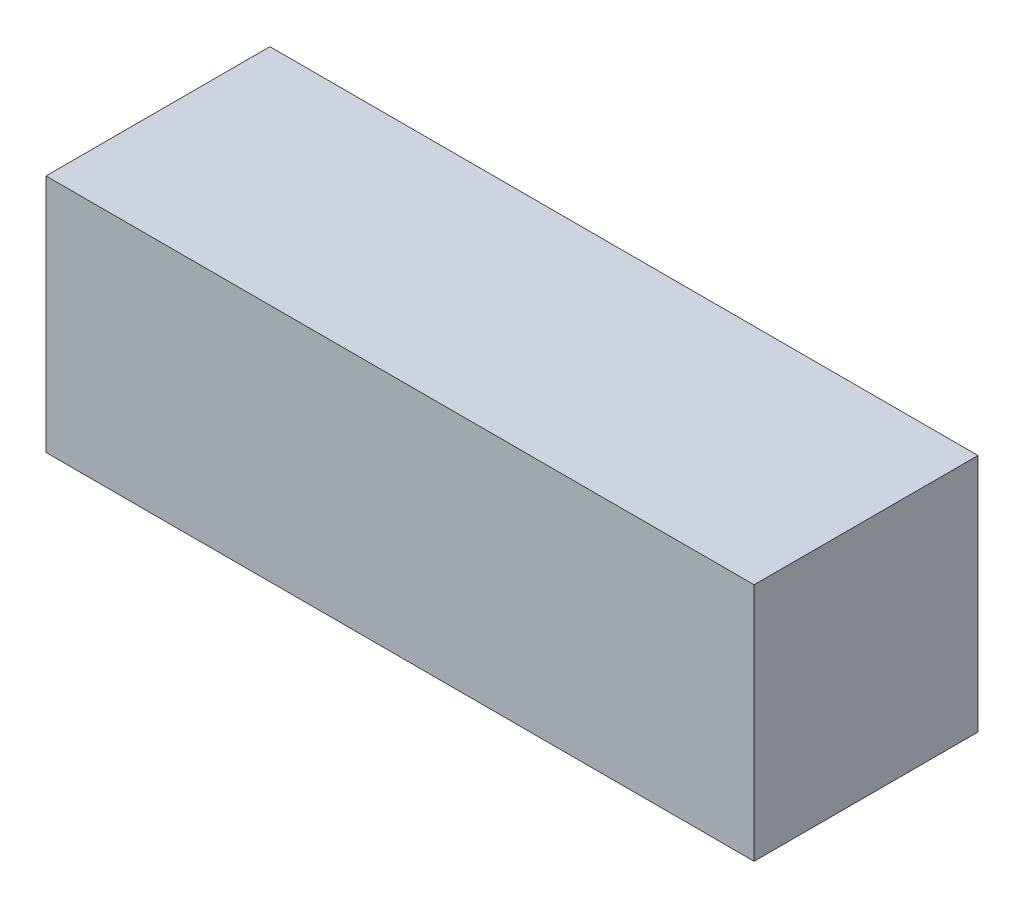
ISO-10303-21;
HEADER;
FILE_DESCRIPTION(('STEP AP214'),'2;1');
FILE_NAME('part.step','',(''),(''),'','','');
FILE_SCHEMA(('AUTOMOTIVE_DESIGN { 1 0 10303 214 1 1 1 1 }'));
ENDSEC;
DATA;
#1=APPLICATION_CONTEXT('core data for automotive mechanical design processes');
#2=APPLICATION_PROTOCOL_DEFINITION('international standard','automotive_design',2000,#1);
#3=PRODUCT_CONTEXT('',#1,'mechanical');
#4=PRODUCT('Part','Part','',(#3));
#5=PRODUCT_RELATED_PRODUCT_CATEGORY('part','',(#4));
#6=PRODUCT_DEFINITION_FORMATION('','',#4);
#7=PRODUCT_DEFINITION_CONTEXT('part definition',#1,'design');
#8=PRODUCT_DEFINITION('design','',#6,#7);
#9=PRODUCT_DEFINITION_SHAPE('','',#8);
#10=(LENGTH_UNIT() NAMED_UNIT(*) SI_UNIT(.MILLI.,.METRE.));
#11=(NAMED_UNIT(*) PLANE_ANGLE_UNIT() SI_UNIT($,.RADIAN.));
#12=(NAMED_UNIT(*) SI_UNIT($,.STERADIAN.) SOLID_ANGLE_UNIT());
#13=UNCERTAINTY_MEASURE_WITH_UNIT(LENGTH_MEASURE(1.E-05),#10,'distance_accuracy_value','');
#14=(GEOMETRIC_REPRESENTATION_CONTEXT(3) GLOBAL_UNCERTAINTY_ASSIGNED_CONTEXT((#13)) GLOBAL_UNIT_ASSIGNED_CONTEXT((#10,
#11,#12)) REPRESENTATION_CONTEXT('',''));
#15=CARTESIAN_POINT('',(0.,0.,0.));
#16=DIRECTION('',(0.,0.,1.));
#17=DIRECTION('',(1.,0.,0.));
#18=AXIS2_PLACEMENT_3D('',#15,#16,#17);
#19=CARTESIAN_POINT('',(-56.5,-23.,80.));
#20=DIRECTION('',(0.,0.,1.));
#21=DIRECTION('',(1.,0.,0.));
#22=AXIS2_PLACEMENT_3D('',#19,#20,#21);
#23=PLANE('',#22);
#24=DIRECTION('',(0.,1.,0.));
#25=VECTOR('',#24,1.);
#26=CARTESIAN_POINT('',(-56.5,-23.,80.));
#27=LINE('',#26,#25);
#28=CARTESIAN_POINT('',(-56.5,-23.,80.));
#29=VERTEX_POINT('',#28);
#30=CARTESIAN_POINT('',(-56.5,23.,80.));
#31=VERTEX_POINT('',#30);
#32=EDGE_CURVE('E65',#29,#31,#27,.T.);
#33=ORIENTED_EDGE('',*,*,#32,.F.);
#34=DIRECTION('',(1.,0.,0.));
#35=VECTOR('',#34,1.);
#36=CARTESIAN_POINT('',(-56.5,-23.,80.));
#37=LINE('',#36,#35);
#38=CARTESIAN_POINT('',(79.5,-23.,80.));
#39=VERTEX_POINT('',#38);
#40=EDGE_CURVE('E91',#29,#39,#37,.T.);
#41=ORIENTED_EDGE('',*,*,#40,.T.);
#42=DIRECTION('',(0.,1.,0.));
#43=VECTOR('',#42,1.);
#44=CARTESIAN_POINT('',(79.5,-23.,80.));
#45=LINE('',#44,#43);
#46=CARTESIAN_POINT('',(79.5,23.,80.));
#47=VERTEX_POINT('',#46);
#48=EDGE_CURVE('E67',#39,#47,#45,.T.);
#49=ORIENTED_EDGE('',*,*,#48,.T.);
#50=DIRECTION('',(1.,0.,0.));
#51=VECTOR('',#50,1.);
#52=CARTESIAN_POINT('',(-56.5,23.,80.));
#53=LINE('',#52,#51);
#54=EDGE_CURVE('E10',#31,#47,#53,.T.);
#55=ORIENTED_EDGE('',*,*,#54,.F.);
#56=EDGE_LOOP('',(#33,#41,#49,#55));
#57=FACE_BOUND('',#56,.T.);
#58=ADVANCED_FACE('F15',(#57),#23,.T.);
#59=CARTESIAN_POINT('',(-56.5,-23.,37.));
#60=DIRECTION('',(0.,0.,1.));
#61=DIRECTION('',(1.,0.,0.));
#62=AXIS2_PLACEMENT_3D('',#59,#60,#61);
#63=PLANE('',#62);
#64=DIRECTION('',(1.,0.,0.));
#65=VECTOR('',#64,1.);
#66=CARTESIAN_POINT('',(-56.5,23.,37.));
#67=LINE('',#66,#65);
#68=CARTESIAN_POINT('',(-56.5,23.,37.));
#69=VERTEX_POINT('',#68);
#70=CARTESIAN_POINT('',(79.5,23.,37.));
#71=VERTEX_POINT('',#70);
#72=EDGE_CURVE('E19',#69,#71,#67,.T.);
#73=ORIENTED_EDGE('',*,*,#72,.T.);
#74=DIRECTION('',(0.,1.,0.));
#75=VECTOR('',#74,1.);
#76=CARTESIAN_POINT('',(79.5,-23.,37.));
#77=LINE('',#76,#75);
#78=CARTESIAN_POINT('',(79.5,-23.,37.));
#79=VERTEX_POINT('',#78);
#80=EDGE_CURVE('E88',#79,#71,#77,.T.);
#81=ORIENTED_EDGE('',*,*,#80,.F.);
#82=DIRECTION('',(1.,0.,0.));
#83=VECTOR('',#82,1.);
#84=CARTESIAN_POINT('',(-56.5,-23.,37.));
#85=LINE('',#84,#83);
#86=CARTESIAN_POINT('',(-56.5,-23.,37.));
#87=VERTEX_POINT('',#86);
#88=EDGE_CURVE('E89',#87,#79,#85,.T.);
#89=ORIENTED_EDGE('',*,*,#88,.F.);
#90=DIRECTION('',(0.,1.,0.));
#91=VECTOR('',#90,1.);
#92=CARTESIAN_POINT('',(-56.5,-23.,37.));
#93=LINE('',#92,#91);
#94=EDGE_CURVE('E76',#87,#69,#93,.T.);
#95=ORIENTED_EDGE('',*,*,#94,.T.);
#96=EDGE_LOOP('',(#73,#81,#89,#95));
#97=FACE_BOUND('',#96,.T.);
#98=ADVANCED_FACE('F109',(#97),#63,.F.);
#99=CARTESIAN_POINT('',(-56.5,23.,37.));
#100=DIRECTION('',(0.,1.,0.));
#101=DIRECTION('',(1.,0.,0.));
#102=AXIS2_PLACEMENT_3D('',#99,#100,#101);
#103=PLANE('',#102);
#104=ORIENTED_EDGE('',*,*,#72,.F.);
#105=DIRECTION('',(0.,0.,1.));
#106=VECTOR('',#105,1.);
#107=CARTESIAN_POINT('',(-56.5,23.,37.));
#108=LINE('',#107,#106);
#109=EDGE_CURVE('E70',#69,#31,#108,.T.);
#110=ORIENTED_EDGE('',*,*,#109,.T.);
#111=ORIENTED_EDGE('',*,*,#54,.T.);
#112=DIRECTION('',(0.,0.,1.));
#113=VECTOR('',#112,1.);
#114=CARTESIAN_POINT('',(79.5,23.,37.));
#115=LINE('',#114,#113);
#116=EDGE_CURVE('E86',#71,#47,#115,.T.);
#117=ORIENTED_EDGE('',*,*,#116,.F.);
#118=EDGE_LOOP('',(#104,#110,#111,#117));
#119=FACE_BOUND('',#118,.T.);
#120=ADVANCED_FACE('F71',(#119),#103,.T.);
#121=CARTESIAN_POINT('',(-56.5,-23.,37.));
#122=DIRECTION('',(0.,1.,0.));
#123=DIRECTION('',(1.,0.,0.));
#124=AXIS2_PLACEMENT_3D('',#121,#122,#123);
#125=PLANE('',#124);
#126=DIRECTION('',(0.,0.,1.));
#127=VECTOR('',#126,1.);
#128=CARTESIAN_POINT('',(79.5,-23.,37.));
#129=LINE('',#128,#127);
#130=EDGE_CURVE('E96',#79,#39,#129,.T.);
#131=ORIENTED_EDGE('',*,*,#130,.T.);
#132=ORIENTED_EDGE('',*,*,#40,.F.);
#133=DIRECTION('',(0.,0.,1.));
#134=VECTOR('',#133,1.);
#135=CARTESIAN_POINT('',(-56.5,-23.,37.));
#136=LINE('',#135,#134);
#137=EDGE_CURVE('E80',#87,#29,#136,.T.);
#138=ORIENTED_EDGE('',*,*,#137,.F.);
#139=ORIENTED_EDGE('',*,*,#88,.T.);
#140=EDGE_LOOP('',(#131,#132,#138,#139));
#141=FACE_BOUND('',#140,.T.);
#142=ADVANCED_FACE('F113',(#141),#125,.F.);
#143=CARTESIAN_POINT('',(79.5,-23.,37.));
#144=DIRECTION('',(1.,0.,0.));
#145=DIRECTION('',(0.,1.,0.));
#146=AXIS2_PLACEMENT_3D('',#143,#144,#145);
#147=PLANE('',#146);
#148=ORIENTED_EDGE('',*,*,#130,.F.);
#149=ORIENTED_EDGE('',*,*,#80,.T.);
#150=ORIENTED_EDGE('',*,*,#116,.T.);
#151=ORIENTED_EDGE('',*,*,#48,.F.);
#152=EDGE_LOOP('',(#148,#149,#150,#151));
#153=FACE_BOUND('',#152,.T.);
#154=ADVANCED_FACE('F115',(#153),#147,.T.);
#155=CARTESIAN_POINT('',(-56.5,-23.,37.));
#156=DIRECTION('',(1.,0.,0.));
#157=DIRECTION('',(0.,1.,0.));
#158=AXIS2_PLACEMENT_3D('',#155,#156,#157);
#159=PLANE('',#158);
#160=ORIENTED_EDGE('',*,*,#32,.T.);
#161=ORIENTED_EDGE('',*,*,#109,.F.);
#162=ORIENTED_EDGE('',*,*,#94,.F.);
#163=ORIENTED_EDGE('',*,*,#137,.T.);
#164=EDGE_LOOP('',(#160,#161,#162,#163));
#165=FACE_BOUND('',#164,.T.);
#166=ADVANCED_FACE('F17',(#165),#159,.F.);
#167=CLOSED_SHELL('',(#58,#98,#120,#142,#154,#166));
#168=MANIFOLD_SOLID_BREP('B1',#167);
#169=ADVANCED_BREP_SHAPE_REPRESENTATION('',(#18,#168),#14);
#170=SHAPE_DEFINITION_REPRESENTATION(#9,#169);
ENDSEC;
END-ISO-10303-21;
